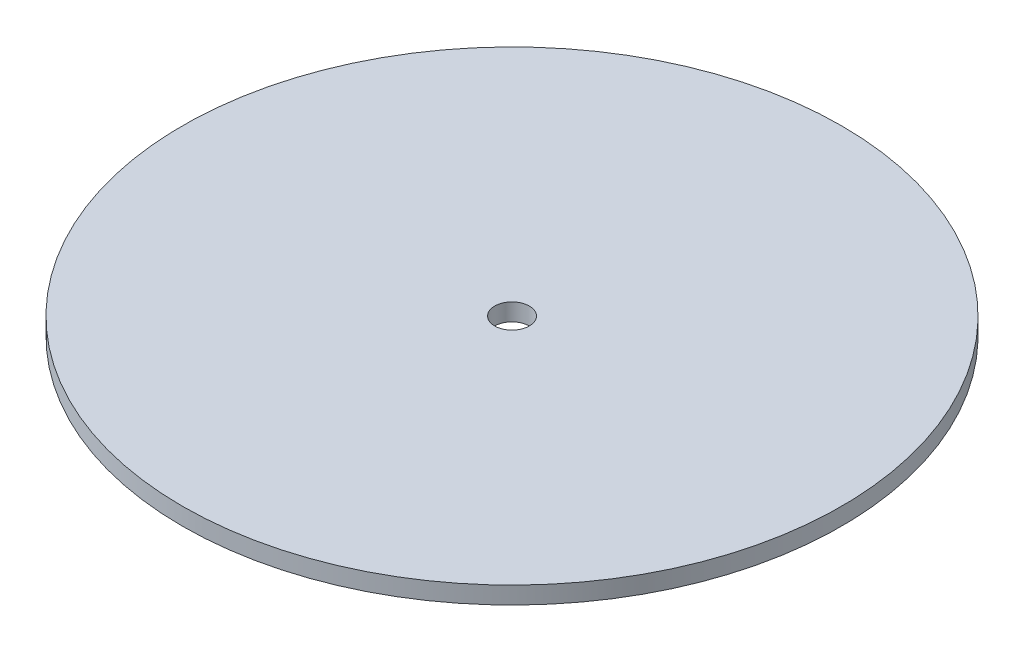
ISO-10303-21;
HEADER;
FILE_DESCRIPTION(('STEP AP214'),'2;1');
FILE_NAME('part.step','',(''),(''),'','','');
FILE_SCHEMA(('AUTOMOTIVE_DESIGN { 1 0 10303 214 1 1 1 1 }'));
ENDSEC;
DATA;
#1=APPLICATION_CONTEXT('core data for automotive mechanical design processes');
#2=APPLICATION_PROTOCOL_DEFINITION('international standard','automotive_design',2000,#1);
#3=PRODUCT_CONTEXT('',#1,'mechanical');
#4=PRODUCT('Part','Part','',(#3));
#5=PRODUCT_RELATED_PRODUCT_CATEGORY('part','',(#4));
#6=PRODUCT_DEFINITION_FORMATION('','',#4);
#7=PRODUCT_DEFINITION_CONTEXT('part definition',#1,'design');
#8=PRODUCT_DEFINITION('design','',#6,#7);
#9=PRODUCT_DEFINITION_SHAPE('','',#8);
#10=(LENGTH_UNIT() NAMED_UNIT(*) SI_UNIT(.MILLI.,.METRE.));
#11=(NAMED_UNIT(*) PLANE_ANGLE_UNIT() SI_UNIT($,.RADIAN.));
#12=(NAMED_UNIT(*) SI_UNIT($,.STERADIAN.) SOLID_ANGLE_UNIT());
#13=UNCERTAINTY_MEASURE_WITH_UNIT(LENGTH_MEASURE(1.E-05),#10,'distance_accuracy_value','');
#14=(GEOMETRIC_REPRESENTATION_CONTEXT(3) GLOBAL_UNCERTAINTY_ASSIGNED_CONTEXT((#13)) GLOBAL_UNIT_ASSIGNED_CONTEXT((#10,
#11,#12)) REPRESENTATION_CONTEXT('',''));
#15=CARTESIAN_POINT('',(0.,0.,0.));
#16=DIRECTION('',(0.,0.,1.));
#17=DIRECTION('',(1.,0.,0.));
#18=AXIS2_PLACEMENT_3D('',#15,#16,#17);
#19=CARTESIAN_POINT('',(0.,4.,0.));
#20=DIRECTION('',(0.,-1.,0.));
#21=DIRECTION('',(0.,0.,-1.));
#22=AXIS2_PLACEMENT_3D('',#19,#20,#21);
#23=CYLINDRICAL_SURFACE('',#22,4.);
#24=CARTESIAN_POINT('',(0.,4.,0.));
#25=DIRECTION('',(0.,1.,0.));
#26=DIRECTION('',(0.,0.,1.));
#27=AXIS2_PLACEMENT_3D('',#24,#25,#26);
#28=CIRCLE('',#27,4.);
#29=CARTESIAN_POINT('',(0.,4.,4.));
#30=VERTEX_POINT('',#29);
#31=EDGE_CURVE('E38',#30,#30,#28,.T.);
#32=ORIENTED_EDGE('',*,*,#31,.T.);
#33=EDGE_LOOP('',(#32));
#34=FACE_BOUND('',#33,.T.);
#35=CARTESIAN_POINT('',(0.,0.,0.));
#36=DIRECTION('',(0.,1.,0.));
#37=DIRECTION('',(0.,0.,1.));
#38=AXIS2_PLACEMENT_3D('',#35,#36,#37);
#39=CIRCLE('',#38,4.);
#40=CARTESIAN_POINT('',(0.,0.,4.));
#41=VERTEX_POINT('',#40);
#42=EDGE_CURVE('E44',#41,#41,#39,.T.);
#43=ORIENTED_EDGE('',*,*,#42,.F.);
#44=EDGE_LOOP('',(#43));
#45=FACE_BOUND('',#44,.T.);
#46=ADVANCED_FACE('F31',(#34,#45),#23,.F.);
#47=CARTESIAN_POINT('',(0.,4.,0.));
#48=DIRECTION('',(0.,-1.,0.));
#49=DIRECTION('',(0.,0.,-1.));
#50=AXIS2_PLACEMENT_3D('',#47,#48,#49);
#51=CYLINDRICAL_SURFACE('',#50,76.2);
#52=CARTESIAN_POINT('',(0.,4.,0.));
#53=DIRECTION('',(0.,1.,0.));
#54=DIRECTION('',(0.,0.,1.));
#55=AXIS2_PLACEMENT_3D('',#52,#53,#54);
#56=CIRCLE('',#55,76.2);
#57=CARTESIAN_POINT('',(0.,4.,76.2));
#58=VERTEX_POINT('',#57);
#59=EDGE_CURVE('E10',#58,#58,#56,.T.);
#60=ORIENTED_EDGE('',*,*,#59,.F.);
#61=EDGE_LOOP('',(#60));
#62=FACE_BOUND('',#61,.T.);
#63=CARTESIAN_POINT('',(0.,0.,0.));
#64=DIRECTION('',(0.,1.,0.));
#65=DIRECTION('',(0.,0.,1.));
#66=AXIS2_PLACEMENT_3D('',#63,#64,#65);
#67=CIRCLE('',#66,76.2);
#68=CARTESIAN_POINT('',(0.,0.,76.2));
#69=VERTEX_POINT('',#68);
#70=EDGE_CURVE('E34',#69,#69,#67,.T.);
#71=ORIENTED_EDGE('',*,*,#70,.T.);
#72=EDGE_LOOP('',(#71));
#73=FACE_BOUND('',#72,.T.);
#74=ADVANCED_FACE('F51',(#62,#73),#51,.T.);
#75=CARTESIAN_POINT('',(0.,4.,0.));
#76=DIRECTION('',(0.,1.,0.));
#77=DIRECTION('',(0.,0.,1.));
#78=AXIS2_PLACEMENT_3D('',#75,#76,#77);
#79=PLANE('',#78);
#80=ORIENTED_EDGE('',*,*,#31,.F.);
#81=EDGE_LOOP('',(#80));
#82=FACE_BOUND('',#81,.T.);
#83=ORIENTED_EDGE('',*,*,#59,.T.);
#84=EDGE_LOOP('',(#83));
#85=FACE_BOUND('',#84,.T.);
#86=ADVANCED_FACE('F55',(#82,#85),#79,.T.);
#87=CARTESIAN_POINT('',(0.,0.,0.));
#88=DIRECTION('',(0.,1.,0.));
#89=DIRECTION('',(0.,0.,1.));
#90=AXIS2_PLACEMENT_3D('',#87,#88,#89);
#91=PLANE('',#90);
#92=ORIENTED_EDGE('',*,*,#42,.T.);
#93=EDGE_LOOP('',(#92));
#94=FACE_BOUND('',#93,.T.);
#95=ORIENTED_EDGE('',*,*,#70,.F.);
#96=EDGE_LOOP('',(#95));
#97=FACE_BOUND('',#96,.T.);
#98=ADVANCED_FACE('F53',(#94,#97),#91,.F.);
#99=CLOSED_SHELL('',(#46,#74,#86,#98));
#100=MANIFOLD_SOLID_BREP('B2',#99);
#101=ADVANCED_BREP_SHAPE_REPRESENTATION('',(#18,#100),#14);
#102=SHAPE_DEFINITION_REPRESENTATION(#9,#101);
ENDSEC;
END-ISO-10303-21;
